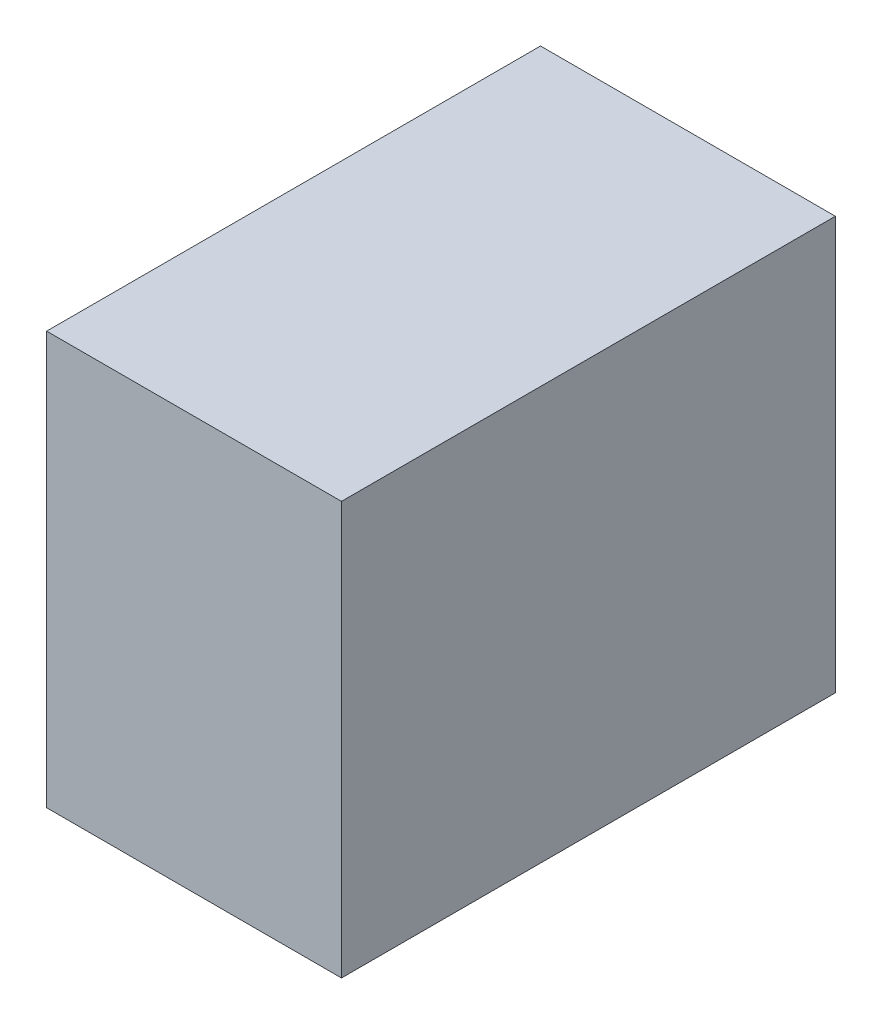
ISO-10303-21;
HEADER;
FILE_DESCRIPTION(('STEP AP214'),'2;1');
FILE_NAME('part.step','',(''),(''),'','','');
FILE_SCHEMA(('AUTOMOTIVE_DESIGN { 1 0 10303 214 1 1 1 1 }'));
ENDSEC;
DATA;
#1=APPLICATION_CONTEXT('core data for automotive mechanical design processes');
#2=APPLICATION_PROTOCOL_DEFINITION('international standard','automotive_design',2000,#1);
#3=PRODUCT_CONTEXT('',#1,'mechanical');
#4=PRODUCT('Part','Part','',(#3));
#5=PRODUCT_RELATED_PRODUCT_CATEGORY('part','',(#4));
#6=PRODUCT_DEFINITION_FORMATION('','',#4);
#7=PRODUCT_DEFINITION_CONTEXT('part definition',#1,'design');
#8=PRODUCT_DEFINITION('design','',#6,#7);
#9=PRODUCT_DEFINITION_SHAPE('','',#8);
#10=(LENGTH_UNIT() NAMED_UNIT(*) SI_UNIT(.MILLI.,.METRE.));
#11=(NAMED_UNIT(*) PLANE_ANGLE_UNIT() SI_UNIT($,.RADIAN.));
#12=(NAMED_UNIT(*) SI_UNIT($,.STERADIAN.) SOLID_ANGLE_UNIT());
#13=UNCERTAINTY_MEASURE_WITH_UNIT(LENGTH_MEASURE(1.E-05),#10,'distance_accuracy_value','');
#14=(GEOMETRIC_REPRESENTATION_CONTEXT(3) GLOBAL_UNCERTAINTY_ASSIGNED_CONTEXT((#13)) GLOBAL_UNIT_ASSIGNED_CONTEXT((#10,
#11,#12)) REPRESENTATION_CONTEXT('',''));
#15=CARTESIAN_POINT('',(0.,0.,0.));
#16=DIRECTION('',(0.,0.,1.));
#17=DIRECTION('',(1.,0.,0.));
#18=AXIS2_PLACEMENT_3D('',#15,#16,#17);
#19=CARTESIAN_POINT('',(-24.6153846153846,22.8717948717949,67.));
#20=DIRECTION('',(1.,0.,0.));
#21=DIRECTION('',(0.,0.,-1.));
#22=AXIS2_PLACEMENT_3D('',#19,#20,#21);
#23=PLANE('',#22);
#24=DIRECTION('',(0.,-1.,0.));
#25=VECTOR('',#24,1.);
#26=CARTESIAN_POINT('',(-24.6153846153846,22.8717948717949,0.));
#27=LINE('',#26,#25);
#28=CARTESIAN_POINT('',(-24.6153846153846,22.8717948717949,0.));
#29=VERTEX_POINT('',#28);
#30=CARTESIAN_POINT('',(-24.6153846153846,-33.1282051282051,0.));
#31=VERTEX_POINT('',#30);
#32=EDGE_CURVE('E107',#29,#31,#27,.T.);
#33=ORIENTED_EDGE('',*,*,#32,.T.);
#34=DIRECTION('',(0.,0.,-1.));
#35=VECTOR('',#34,1.);
#36=CARTESIAN_POINT('',(-24.6153846153846,-33.1282051282051,67.));
#37=LINE('',#36,#35);
#38=CARTESIAN_POINT('',(-24.6153846153846,-33.1282051282051,67.));
#39=VERTEX_POINT('',#38);
#40=EDGE_CURVE('E11',#39,#31,#37,.T.);
#41=ORIENTED_EDGE('',*,*,#40,.F.);
#42=DIRECTION('',(0.,-1.,0.));
#43=VECTOR('',#42,1.);
#44=CARTESIAN_POINT('',(-24.6153846153846,22.8717948717949,67.));
#45=LINE('',#44,#43);
#46=CARTESIAN_POINT('',(-24.6153846153846,22.8717948717949,67.));
#47=VERTEX_POINT('',#46);
#48=EDGE_CURVE('E91',#47,#39,#45,.T.);
#49=ORIENTED_EDGE('',*,*,#48,.F.);
#50=DIRECTION('',(0.,0.,-1.));
#51=VECTOR('',#50,1.);
#52=CARTESIAN_POINT('',(-24.6153846153846,22.8717948717949,67.));
#53=LINE('',#52,#51);
#54=EDGE_CURVE('E103',#47,#29,#53,.T.);
#55=ORIENTED_EDGE('',*,*,#54,.T.);
#56=EDGE_LOOP('',(#33,#41,#49,#55));
#57=FACE_BOUND('',#56,.T.);
#58=ADVANCED_FACE('F39',(#57),#23,.F.);
#59=CARTESIAN_POINT('',(-24.6153846153846,-33.1282051282051,67.));
#60=DIRECTION('',(0.,1.,0.));
#61=DIRECTION('',(0.,0.,1.));
#62=AXIS2_PLACEMENT_3D('',#59,#60,#61);
#63=PLANE('',#62);
#64=DIRECTION('',(1.,0.,0.));
#65=VECTOR('',#64,1.);
#66=CARTESIAN_POINT('',(-24.6153846153846,-33.1282051282051,0.));
#67=LINE('',#66,#65);
#68=CARTESIAN_POINT('',(15.3846153846154,-33.1282051282051,0.));
#69=VERTEX_POINT('',#68);
#70=EDGE_CURVE('E96',#31,#69,#67,.T.);
#71=ORIENTED_EDGE('',*,*,#70,.T.);
#72=DIRECTION('',(0.,0.,-1.));
#73=VECTOR('',#72,1.);
#74=CARTESIAN_POINT('',(15.3846153846154,-33.1282051282051,67.));
#75=LINE('',#74,#73);
#76=CARTESIAN_POINT('',(15.3846153846154,-33.1282051282051,67.));
#77=VERTEX_POINT('',#76);
#78=EDGE_CURVE('E48',#77,#69,#75,.T.);
#79=ORIENTED_EDGE('',*,*,#78,.F.);
#80=DIRECTION('',(1.,0.,0.));
#81=VECTOR('',#80,1.);
#82=CARTESIAN_POINT('',(-24.6153846153846,-33.1282051282051,67.));
#83=LINE('',#82,#81);
#84=EDGE_CURVE('E86',#39,#77,#83,.T.);
#85=ORIENTED_EDGE('',*,*,#84,.F.);
#86=ORIENTED_EDGE('',*,*,#40,.T.);
#87=EDGE_LOOP('',(#71,#79,#85,#86));
#88=FACE_BOUND('',#87,.T.);
#89=ADVANCED_FACE('F95',(#88),#63,.F.);
#90=CARTESIAN_POINT('',(15.3846153846154,22.8717948717949,67.));
#91=DIRECTION('',(-1.,0.,0.));
#92=DIRECTION('',(0.,-1.,0.));
#93=AXIS2_PLACEMENT_3D('',#90,#91,#92);
#94=PLANE('',#93);
#95=DIRECTION('',(0.,1.,0.));
#96=VECTOR('',#95,1.);
#97=CARTESIAN_POINT('',(15.3846153846154,22.8717948717949,0.));
#98=LINE('',#97,#96);
#99=CARTESIAN_POINT('',(15.3846153846154,22.8717948717949,0.));
#100=VERTEX_POINT('',#99);
#101=EDGE_CURVE('E73',#69,#100,#98,.T.);
#102=ORIENTED_EDGE('',*,*,#101,.T.);
#103=DIRECTION('',(0.,0.,-1.));
#104=VECTOR('',#103,1.);
#105=CARTESIAN_POINT('',(15.3846153846154,22.8717948717949,67.));
#106=LINE('',#105,#104);
#107=CARTESIAN_POINT('',(15.3846153846154,22.8717948717949,67.));
#108=VERTEX_POINT('',#107);
#109=EDGE_CURVE('E98',#108,#100,#106,.T.);
#110=ORIENTED_EDGE('',*,*,#109,.F.);
#111=DIRECTION('',(0.,1.,0.));
#112=VECTOR('',#111,1.);
#113=CARTESIAN_POINT('',(15.3846153846154,22.8717948717949,67.));
#114=LINE('',#113,#112);
#115=EDGE_CURVE('E89',#77,#108,#114,.T.);
#116=ORIENTED_EDGE('',*,*,#115,.F.);
#117=ORIENTED_EDGE('',*,*,#78,.T.);
#118=EDGE_LOOP('',(#102,#110,#116,#117));
#119=FACE_BOUND('',#118,.T.);
#120=ADVANCED_FACE('F99',(#119),#94,.F.);
#121=CARTESIAN_POINT('',(-24.6153846153846,22.8717948717949,67.));
#122=DIRECTION('',(0.,-1.,0.));
#123=DIRECTION('',(0.,0.,-1.));
#124=AXIS2_PLACEMENT_3D('',#121,#122,#123);
#125=PLANE('',#124);
#126=DIRECTION('',(-1.,0.,0.));
#127=VECTOR('',#126,1.);
#128=CARTESIAN_POINT('',(-24.6153846153846,22.8717948717949,0.));
#129=LINE('',#128,#127);
#130=EDGE_CURVE('E79',#100,#29,#129,.T.);
#131=ORIENTED_EDGE('',*,*,#130,.T.);
#132=ORIENTED_EDGE('',*,*,#54,.F.);
#133=DIRECTION('',(-1.,0.,0.));
#134=VECTOR('',#133,1.);
#135=CARTESIAN_POINT('',(-24.6153846153846,22.8717948717949,67.));
#136=LINE('',#135,#134);
#137=EDGE_CURVE('E56',#108,#47,#136,.T.);
#138=ORIENTED_EDGE('',*,*,#137,.F.);
#139=ORIENTED_EDGE('',*,*,#109,.T.);
#140=EDGE_LOOP('',(#131,#132,#138,#139));
#141=FACE_BOUND('',#140,.T.);
#142=ADVANCED_FACE('F120',(#141),#125,.F.);
#143=CARTESIAN_POINT('',(0.,0.,67.));
#144=DIRECTION('',(0.,0.,1.));
#145=DIRECTION('',(1.,0.,0.));
#146=AXIS2_PLACEMENT_3D('',#143,#144,#145);
#147=PLANE('',#146);
#148=ORIENTED_EDGE('',*,*,#48,.T.);
#149=ORIENTED_EDGE('',*,*,#84,.T.);
#150=ORIENTED_EDGE('',*,*,#115,.T.);
#151=ORIENTED_EDGE('',*,*,#137,.T.);
#152=EDGE_LOOP('',(#148,#149,#150,#151));
#153=FACE_BOUND('',#152,.T.);
#154=ADVANCED_FACE('F87',(#153),#147,.T.);
#155=CARTESIAN_POINT('',(0.,0.,0.));
#156=DIRECTION('',(0.,0.,1.));
#157=DIRECTION('',(1.,0.,0.));
#158=AXIS2_PLACEMENT_3D('',#155,#156,#157);
#159=PLANE('',#158);
#160=ORIENTED_EDGE('',*,*,#32,.F.);
#161=ORIENTED_EDGE('',*,*,#130,.F.);
#162=ORIENTED_EDGE('',*,*,#101,.F.);
#163=ORIENTED_EDGE('',*,*,#70,.F.);
#164=EDGE_LOOP('',(#160,#161,#162,#163));
#165=FACE_BOUND('',#164,.T.);
#166=ADVANCED_FACE('F123',(#165),#159,.F.);
#167=CLOSED_SHELL('',(#58,#89,#120,#142,#154,#166));
#168=MANIFOLD_SOLID_BREP('B2',#167);
#169=ADVANCED_BREP_SHAPE_REPRESENTATION('',(#18,#168),#14);
#170=SHAPE_DEFINITION_REPRESENTATION(#9,#169);
ENDSEC;
END-ISO-10303-21;
